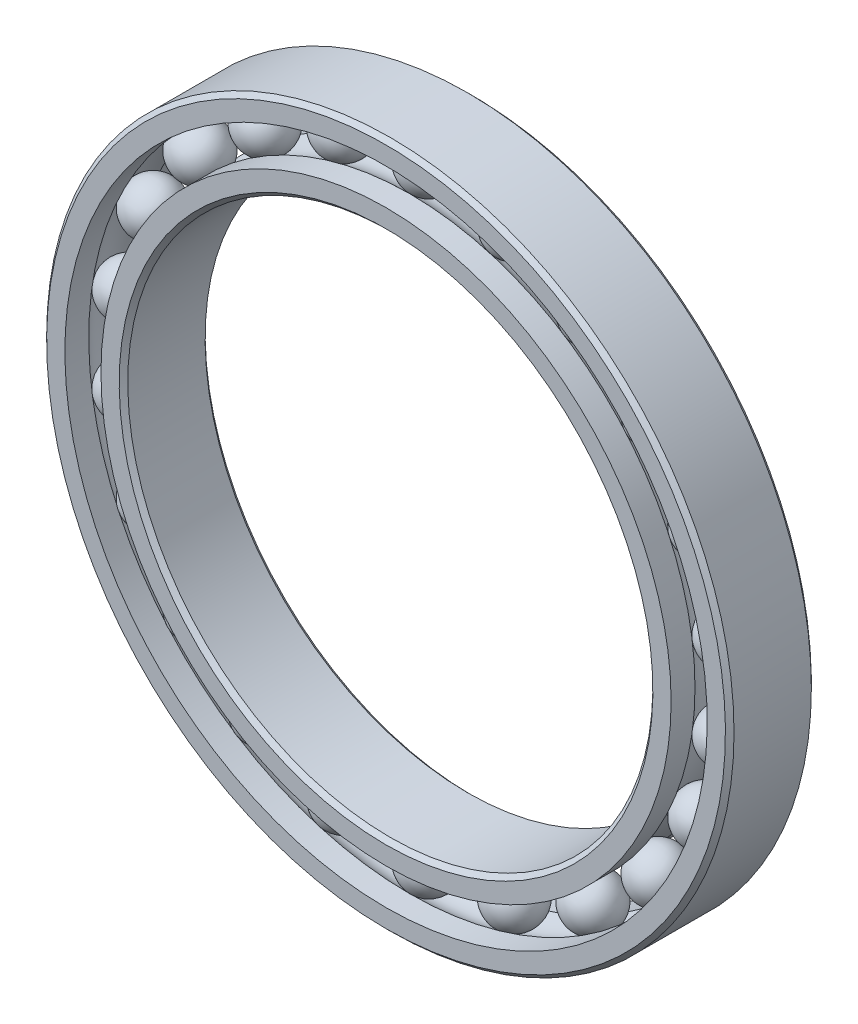
ISO-10303-21;
HEADER;
FILE_DESCRIPTION(('STEP AP214'),'2;1');
FILE_NAME('part.step','',(''),(''),'','','');
FILE_SCHEMA(('AUTOMOTIVE_DESIGN { 1 0 10303 214 1 1 1 1 }'));
ENDSEC;
DATA;
#1=APPLICATION_CONTEXT('core data for automotive mechanical design processes');
#2=APPLICATION_PROTOCOL_DEFINITION('international standard','automotive_design',2000,#1);
#3=PRODUCT_CONTEXT('',#1,'mechanical');
#4=PRODUCT('Part','Part','',(#3));
#5=PRODUCT_RELATED_PRODUCT_CATEGORY('part','',(#4));
#6=PRODUCT_DEFINITION_FORMATION('','',#4);
#7=PRODUCT_DEFINITION_CONTEXT('part definition',#1,'design');
#8=PRODUCT_DEFINITION('design','',#6,#7);
#9=PRODUCT_DEFINITION_SHAPE('','',#8);
#10=(LENGTH_UNIT() NAMED_UNIT(*) SI_UNIT(.MILLI.,.METRE.));
#11=(NAMED_UNIT(*) PLANE_ANGLE_UNIT() SI_UNIT($,.RADIAN.));
#12=(NAMED_UNIT(*) SI_UNIT($,.STERADIAN.) SOLID_ANGLE_UNIT());
#13=UNCERTAINTY_MEASURE_WITH_UNIT(LENGTH_MEASURE(1.E-05),#10,'distance_accuracy_value','');
#14=(GEOMETRIC_REPRESENTATION_CONTEXT(3) GLOBAL_UNCERTAINTY_ASSIGNED_CONTEXT((#13)) GLOBAL_UNIT_ASSIGNED_CONTEXT((#10,
#11,#12)) REPRESENTATION_CONTEXT('',''));
#15=CARTESIAN_POINT('',(0.,0.,0.));
#16=DIRECTION('',(0.,0.,1.));
#17=DIRECTION('',(1.,0.,0.));
#18=AXIS2_PLACEMENT_3D('',#15,#16,#17);
#19=CARTESIAN_POINT('',(8.94500867971496,30.4639019122604,0.));
#20=DIRECTION('',(0.,0.,1.));
#21=DIRECTION('',(0.281732556841416,0.959492973614501,0.));
#22=AXIS2_PLACEMENT_3D('',#19,#20,#21);
#23=SPHERICAL_SURFACE('',#22,2.75098186736443);
#24=CARTESIAN_POINT('',(8.94500867971496,30.4639019122604,2.75098186736443));
#25=VERTEX_POINT('',#24);
#26=VERTEX_LOOP('',#25);
#27=FACE_BOUND('',#26,.T.);
#28=ADVANCED_FACE('F46',(#27),#23,.T.);
#29=CLOSED_SHELL('',(#28));
#30=MANIFOLD_SOLID_BREP('B2',#29);
#31=CARTESIAN_POINT('',(17.1653459542149,26.7097996673902,0.));
#32=DIRECTION('',(0.,0.,1.));
#33=DIRECTION('',(0.540640817455586,0.841253532831188,0.));
#34=AXIS2_PLACEMENT_3D('',#31,#32,#33);
#35=SPHERICAL_SURFACE('',#34,2.75098186736443);
#36=CARTESIAN_POINT('',(17.1653459542149,26.7097996673902,2.75098186736443));
#37=VERTEX_POINT('',#36);
#38=VERTEX_LOOP('',#37);
#39=FACE_BOUND('',#38,.T.);
#40=ADVANCED_FACE('F65',(#39),#35,.T.);
#41=CLOSED_SHELL('',(#40));
#42=MANIFOLD_SOLID_BREP('B6',#41);
#43=CARTESIAN_POINT('',(23.9950489857474,20.7918283027631,0.));
#44=DIRECTION('',(0.,0.,1.));
#45=DIRECTION('',(0.75574957435425,0.654860733945295,0.));
#46=AXIS2_PLACEMENT_3D('',#43,#44,#45);
#47=SPHERICAL_SURFACE('',#46,2.75098186736443);
#48=CARTESIAN_POINT('',(23.9950489857474,20.7918283027631,2.75098186736443));
#49=VERTEX_POINT('',#48);
#50=VERTEX_LOOP('',#49);
#51=FACE_BOUND('',#50,.T.);
#52=ADVANCED_FACE('F84',(#51),#47,.T.);
#53=CLOSED_SHELL('',(#52));
#54=MANIFOLD_SOLID_BREP('B42',#53);
#55=CARTESIAN_POINT('',(28.8808158525058,13.1894266628102,0.));
#56=DIRECTION('',(0.,0.,1.));
#57=DIRECTION('',(0.909631995354513,0.415415013001897,0.));
#58=AXIS2_PLACEMENT_3D('',#55,#56,#57);
#59=SPHERICAL_SURFACE('',#58,2.75098186736443);
#60=CARTESIAN_POINT('',(28.8808158525058,13.1894266628102,2.75098186736442));
#61=VERTEX_POINT('',#60);
#62=VERTEX_LOOP('',#61);
#63=FACE_BOUND('',#62,.T.);
#64=ADVANCED_FACE('F103',(#63),#59,.T.);
#65=CLOSED_SHELL('',(#64));
#66=MANIFOLD_SOLID_BREP('B61',#65);
#67=CARTESIAN_POINT('',(31.4268307797196,4.51849611517716,0.));
#68=DIRECTION('',(0.,0.,1.));
#69=DIRECTION('',(0.989821441880931,0.142314838273296,0.));
#70=AXIS2_PLACEMENT_3D('',#67,#68,#69);
#71=SPHERICAL_SURFACE('',#70,2.75098186736443);
#72=CARTESIAN_POINT('',(31.4268307797196,4.51849611517716,2.75098186736442));
#73=VERTEX_POINT('',#72);
#74=VERTEX_LOOP('',#73);
#75=FACE_BOUND('',#74,.T.);
#76=ADVANCED_FACE('F122',(#75),#71,.T.);
#77=CLOSED_SHELL('',(#76));
#78=MANIFOLD_SOLID_BREP('B80',#77);
#79=CARTESIAN_POINT('',(31.4268307797197,-4.51849611517647,0.));
#80=DIRECTION('',(0.,0.,1.));
#81=DIRECTION('',(0.989821441880934,-0.142314838273275,0.));
#82=AXIS2_PLACEMENT_3D('',#79,#80,#81);
#83=SPHERICAL_SURFACE('',#82,2.75098186736443);
#84=CARTESIAN_POINT('',(31.4268307797197,-4.51849611517647,2.75098186736442));
#85=VERTEX_POINT('',#84);
#86=VERTEX_LOOP('',#85);
#87=FACE_BOUND('',#86,.T.);
#88=ADVANCED_FACE('F141',(#87),#83,.T.);
#89=CLOSED_SHELL('',(#88));
#90=MANIFOLD_SOLID_BREP('B99',#89);
#91=CARTESIAN_POINT('',(28.8808158525061,-13.1894266628096,0.));
#92=DIRECTION('',(0.,0.,1.));
#93=DIRECTION('',(0.909631995354522,-0.415415013001877,0.));
#94=AXIS2_PLACEMENT_3D('',#91,#92,#93);
#95=SPHERICAL_SURFACE('',#94,2.75098186736443);
#96=CARTESIAN_POINT('',(28.8808158525061,-13.1894266628096,2.75098186736442));
#97=VERTEX_POINT('',#96);
#98=VERTEX_LOOP('',#97);
#99=FACE_BOUND('',#98,.T.);
#100=ADVANCED_FACE('F160',(#99),#95,.T.);
#101=CLOSED_SHELL('',(#100));
#102=MANIFOLD_SOLID_BREP('B118',#101);
#103=CARTESIAN_POINT('',(23.9950489857479,-20.7918283027626,0.));
#104=DIRECTION('',(0.,0.,1.));
#105=DIRECTION('',(0.755749574354264,-0.654860733945278,0.));
#106=AXIS2_PLACEMENT_3D('',#103,#104,#105);
#107=SPHERICAL_SURFACE('',#106,2.75098186736443);
#108=CARTESIAN_POINT('',(23.9950489857479,-20.7918283027626,2.75098186736442));
#109=VERTEX_POINT('',#108);
#110=VERTEX_LOOP('',#109);
#111=FACE_BOUND('',#110,.T.);
#112=ADVANCED_FACE('F179',(#111),#107,.T.);
#113=CLOSED_SHELL('',(#112));
#114=MANIFOLD_SOLID_BREP('B137',#113);
#115=CARTESIAN_POINT('',(17.1653459542154,-26.7097996673899,0.));
#116=DIRECTION('',(0.,0.,1.));
#117=DIRECTION('',(0.540640817455605,-0.841253532831177,0.));
#118=AXIS2_PLACEMENT_3D('',#115,#116,#117);
#119=SPHERICAL_SURFACE('',#118,2.75098186736443);
#120=CARTESIAN_POINT('',(17.1653459542154,-26.7097996673899,2.75098186736442));
#121=VERTEX_POINT('',#120);
#122=VERTEX_LOOP('',#121);
#123=FACE_BOUND('',#122,.T.);
#124=ADVANCED_FACE('F198',(#123),#119,.T.);
#125=CLOSED_SHELL('',(#124));
#126=MANIFOLD_SOLID_BREP('B156',#125);
#127=CARTESIAN_POINT('',(8.94500867971563,-30.4639019122602,0.));
#128=DIRECTION('',(0.,0.,1.));
#129=DIRECTION('',(0.281732556841437,-0.959492973614495,0.));
#130=AXIS2_PLACEMENT_3D('',#127,#128,#129);
#131=SPHERICAL_SURFACE('',#130,2.75098186736443);
#132=CARTESIAN_POINT('',(8.94500867971563,-30.4639019122602,2.75098186736442));
#133=VERTEX_POINT('',#132);
#134=VERTEX_LOOP('',#133);
#135=FACE_BOUND('',#134,.T.);
#136=ADVANCED_FACE('F217',(#135),#131,.T.);
#137=CLOSED_SHELL('',(#136));
#138=MANIFOLD_SOLID_BREP('B175',#137);
#139=CARTESIAN_POINT('',(0.,-31.75,0.));
#140=DIRECTION('',(0.,0.,1.));
#141=DIRECTION('',(0.,-1.,0.));
#142=AXIS2_PLACEMENT_3D('',#139,#140,#141);
#143=SPHERICAL_SURFACE('',#142,2.75098186736443);
#144=CARTESIAN_POINT('',(0.,-31.75,2.75098186736442));
#145=VERTEX_POINT('',#144);
#146=VERTEX_LOOP('',#145);
#147=FACE_BOUND('',#146,.T.);
#148=ADVANCED_FACE('F236',(#147),#143,.T.);
#149=CLOSED_SHELL('',(#148));
#150=MANIFOLD_SOLID_BREP('B194',#149);
#151=CARTESIAN_POINT('',(-8.94500867971519,-30.4639019122604,0.));
#152=DIRECTION('',(0.,0.,1.));
#153=DIRECTION('',(-0.281732556841423,-0.959492973614499,0.));
#154=AXIS2_PLACEMENT_3D('',#151,#152,#153);
#155=SPHERICAL_SURFACE('',#154,2.75098186736443);
#156=CARTESIAN_POINT('',(-8.94500867971519,-30.4639019122604,2.75098186736442));
#157=VERTEX_POINT('',#156);
#158=VERTEX_LOOP('',#157);
#159=FACE_BOUND('',#158,.T.);
#160=ADVANCED_FACE('F255',(#159),#155,.T.);
#161=CLOSED_SHELL('',(#160));
#162=MANIFOLD_SOLID_BREP('B213',#161);
#163=CARTESIAN_POINT('',(-17.1653459542151,-26.7097996673901,0.));
#164=DIRECTION('',(0.,0.,1.));
#165=DIRECTION('',(-0.540640817455593,-0.841253532831184,0.));
#166=AXIS2_PLACEMENT_3D('',#163,#164,#165);
#167=SPHERICAL_SURFACE('',#166,2.75098186736443);
#168=CARTESIAN_POINT('',(-17.1653459542151,-26.7097996673901,2.75098186736442));
#169=VERTEX_POINT('',#168);
#170=VERTEX_LOOP('',#169);
#171=FACE_BOUND('',#170,.T.);
#172=ADVANCED_FACE('F274',(#171),#167,.T.);
#173=CLOSED_SHELL('',(#172));
#174=MANIFOLD_SOLID_BREP('B232',#173);
#175=CARTESIAN_POINT('',(-23.9950489857476,-20.7918283027629,0.));
#176=DIRECTION('',(0.,0.,1.));
#177=DIRECTION('',(-0.755749574354255,-0.654860733945289,0.));
#178=AXIS2_PLACEMENT_3D('',#175,#176,#177);
#179=SPHERICAL_SURFACE('',#178,2.75098186736443);
#180=CARTESIAN_POINT('',(-23.9950489857476,-20.7918283027629,2.75098186736442));
#181=VERTEX_POINT('',#180);
#182=VERTEX_LOOP('',#181);
#183=FACE_BOUND('',#182,.T.);
#184=ADVANCED_FACE('F293',(#183),#179,.T.);
#185=CLOSED_SHELL('',(#184));
#186=MANIFOLD_SOLID_BREP('B251',#185);
#187=CARTESIAN_POINT('',(-28.8808158525059,-13.18942666281,0.));
#188=DIRECTION('',(0.,0.,1.));
#189=DIRECTION('',(-0.909631995354516,-0.415415013001891,0.));
#190=AXIS2_PLACEMENT_3D('',#187,#188,#189);
#191=SPHERICAL_SURFACE('',#190,2.75098186736443);
#192=CARTESIAN_POINT('',(-28.8808158525059,-13.18942666281,2.75098186736442));
#193=VERTEX_POINT('',#192);
#194=VERTEX_LOOP('',#193);
#195=FACE_BOUND('',#194,.T.);
#196=ADVANCED_FACE('F312',(#195),#191,.T.);
#197=CLOSED_SHELL('',(#196));
#198=MANIFOLD_SOLID_BREP('B270',#197);
#199=CARTESIAN_POINT('',(-31.4268307797196,-4.51849611517692,0.));
#200=DIRECTION('',(0.,0.,1.));
#201=DIRECTION('',(-0.989821441880932,-0.142314838273289,0.));
#202=AXIS2_PLACEMENT_3D('',#199,#200,#201);
#203=SPHERICAL_SURFACE('',#202,2.75098186736443);
#204=CARTESIAN_POINT('',(-31.4268307797196,-4.51849611517692,2.75098186736442));
#205=VERTEX_POINT('',#204);
#206=VERTEX_LOOP('',#205);
#207=FACE_BOUND('',#206,.T.);
#208=ADVANCED_FACE('F331',(#207),#203,.T.);
#209=CLOSED_SHELL('',(#208));
#210=MANIFOLD_SOLID_BREP('B289',#209);
#211=CARTESIAN_POINT('',(-31.4268307797196,4.5184961151767,0.));
#212=DIRECTION('',(0.,0.,1.));
#213=DIRECTION('',(-0.989821441880933,0.142314838273282,0.));
#214=AXIS2_PLACEMENT_3D('',#211,#212,#213);
#215=SPHERICAL_SURFACE('',#214,2.75098186736443);
#216=CARTESIAN_POINT('',(-31.4268307797196,4.5184961151767,2.75098186736442));
#217=VERTEX_POINT('',#216);
#218=VERTEX_LOOP('',#217);
#219=FACE_BOUND('',#218,.T.);
#220=ADVANCED_FACE('F350',(#219),#215,.T.);
#221=CLOSED_SHELL('',(#220));
#222=MANIFOLD_SOLID_BREP('B308',#221);
#223=CARTESIAN_POINT('',(-28.880815852506,13.1894266628098,0.));
#224=DIRECTION('',(0.,0.,1.));
#225=DIRECTION('',(-0.909631995354519,0.415415013001884,0.));
#226=AXIS2_PLACEMENT_3D('',#223,#224,#225);
#227=SPHERICAL_SURFACE('',#226,2.75098186736443);
#228=CARTESIAN_POINT('',(-28.880815852506,13.1894266628098,2.75098186736442));
#229=VERTEX_POINT('',#228);
#230=VERTEX_LOOP('',#229);
#231=FACE_BOUND('',#230,.T.);
#232=ADVANCED_FACE('F369',(#231),#227,.T.);
#233=CLOSED_SHELL('',(#232));
#234=MANIFOLD_SOLID_BREP('B327',#233);
#235=CARTESIAN_POINT('',(-23.9950489857477,20.7918283027628,0.));
#236=DIRECTION('',(0.,0.,1.));
#237=DIRECTION('',(-0.75574957435426,0.654860733945284,0.));
#238=AXIS2_PLACEMENT_3D('',#235,#236,#237);
#239=SPHERICAL_SURFACE('',#238,2.75098186736443);
#240=CARTESIAN_POINT('',(-23.9950489857477,20.7918283027628,2.75098186736443));
#241=VERTEX_POINT('',#240);
#242=VERTEX_LOOP('',#241);
#243=FACE_BOUND('',#242,.T.);
#244=ADVANCED_FACE('F388',(#243),#239,.T.);
#245=CLOSED_SHELL('',(#244));
#246=MANIFOLD_SOLID_BREP('B346',#245);
#247=CARTESIAN_POINT('',(-17.1653459542153,26.70979966739,0.));
#248=DIRECTION('',(0.,0.,1.));
#249=DIRECTION('',(-0.540640817455599,0.841253532831181,0.));
#250=AXIS2_PLACEMENT_3D('',#247,#248,#249);
#251=SPHERICAL_SURFACE('',#250,2.75098186736443);
#252=CARTESIAN_POINT('',(-17.1653459542153,26.70979966739,2.75098186736443));
#253=VERTEX_POINT('',#252);
#254=VERTEX_LOOP('',#253);
#255=FACE_BOUND('',#254,.T.);
#256=ADVANCED_FACE('F407',(#255),#251,.T.);
#257=CLOSED_SHELL('',(#256));
#258=MANIFOLD_SOLID_BREP('B365',#257);
#259=CARTESIAN_POINT('',(-8.94500867971541,30.4639019122603,0.));
#260=DIRECTION('',(0.,0.,1.));
#261=DIRECTION('',(-0.28173255684143,0.959492973614497,0.));
#262=AXIS2_PLACEMENT_3D('',#259,#260,#261);
#263=SPHERICAL_SURFACE('',#262,2.75098186736443);
#264=CARTESIAN_POINT('',(-8.94500867971541,30.4639019122603,2.75098186736443));
#265=VERTEX_POINT('',#264);
#266=VERTEX_LOOP('',#265);
#267=FACE_BOUND('',#266,.T.);
#268=ADVANCED_FACE('F426',(#267),#263,.T.);
#269=CLOSED_SHELL('',(#268));
#270=MANIFOLD_SOLID_BREP('B384',#269);
#271=CARTESIAN_POINT('',(0.,31.75,0.));
#272=DIRECTION('',(0.,0.,1.));
#273=DIRECTION('',(0.,1.,0.));
#274=AXIS2_PLACEMENT_3D('',#271,#272,#273);
#275=SPHERICAL_SURFACE('',#274,2.75098186736443);
#276=CARTESIAN_POINT('',(0.,31.75,2.75098186736443));
#277=VERTEX_POINT('',#276);
#278=VERTEX_LOOP('',#277);
#279=FACE_BOUND('',#278,.T.);
#280=ADVANCED_FACE('F447',(#279),#275,.T.);
#281=CLOSED_SHELL('',(#280));
#282=MANIFOLD_SOLID_BREP('B403',#281);
#283=CARTESIAN_POINT('',(0.,29.8611111111111,4.50000000000001));
#284=DIRECTION('',(0.,0.,-1.));
#285=DIRECTION('',(0.,1.,0.));
#286=AXIS2_PLACEMENT_3D('',#283,#284,#285);
#287=PLANE('',#286);
#288=CARTESIAN_POINT('',(0.,0.,4.5));
#289=DIRECTION('',(0.,0.,1.));
#290=DIRECTION('',(0.,-1.,0.));
#291=AXIS2_PLACEMENT_3D('',#288,#289,#290);
#292=CIRCLE('',#291,27.95);
#293=CARTESIAN_POINT('',(0.,-27.95,4.5));
#294=VERTEX_POINT('',#293);
#295=EDGE_CURVE('E504',#294,#294,#292,.T.);
#296=ORIENTED_EDGE('',*,*,#295,.F.);
#297=EDGE_LOOP('',(#296));
#298=FACE_BOUND('',#297,.T.);
#299=CARTESIAN_POINT('',(0.,0.,4.5));
#300=DIRECTION('',(0.,0.,1.));
#301=DIRECTION('',(0.,-1.,0.));
#302=AXIS2_PLACEMENT_3D('',#299,#300,#301);
#303=CIRCLE('',#302,29.8611111111111);
#304=CARTESIAN_POINT('',(0.,-29.8611111111111,4.5));
#305=VERTEX_POINT('',#304);
#306=EDGE_CURVE('E446',#305,#305,#303,.T.);
#307=ORIENTED_EDGE('',*,*,#306,.T.);
#308=EDGE_LOOP('',(#307));
#309=FACE_BOUND('',#308,.T.);
#310=ADVANCED_FACE('F467',(#298,#309),#287,.F.);
#311=CARTESIAN_POINT('',(0.,0.,4.49999999999999));
#312=DIRECTION('',(0.,0.,1.));
#313=DIRECTION('',(0.,-1.,0.));
#314=AXIS2_PLACEMENT_3D('',#311,#312,#313);
#315=CYLINDRICAL_SURFACE('',#314,29.8611111111111);
#316=ORIENTED_EDGE('',*,*,#306,.F.);
#317=EDGE_LOOP('',(#316));
#318=FACE_BOUND('',#317,.T.);
#319=CARTESIAN_POINT('',(0.,0.,1.99999999999999));
#320=DIRECTION('',(0.,0.,1.));
#321=DIRECTION('',(0.,-1.,0.));
#322=AXIS2_PLACEMENT_3D('',#319,#320,#321);
#323=CIRCLE('',#322,29.8611111111111);
#324=CARTESIAN_POINT('',(0.,-29.8611111111111,1.99999999999999));
#325=VERTEX_POINT('',#324);
#326=EDGE_CURVE('E474',#325,#325,#323,.T.);
#327=ORIENTED_EDGE('',*,*,#326,.T.);
#328=EDGE_LOOP('',(#327));
#329=FACE_BOUND('',#328,.T.);
#330=ADVANCED_FACE('F513',(#318,#329),#315,.T.);
#331=CARTESIAN_POINT('',(0.,0.,0.));
#332=DIRECTION('',(0.,0.,1.));
#333=DIRECTION('',(0.,-1.,0.));
#334=AXIS2_PLACEMENT_3D('',#331,#332,#333);
#335=TOROIDAL_SURFACE('',#334,31.75,2.75098186736443);
#336=ORIENTED_EDGE('',*,*,#326,.F.);
#337=EDGE_LOOP('',(#336));
#338=FACE_BOUND('',#337,.T.);
#339=CARTESIAN_POINT('',(0.,0.,-2.));
#340=DIRECTION('',(0.,0.,1.));
#341=DIRECTION('',(0.,-1.,0.));
#342=AXIS2_PLACEMENT_3D('',#339,#340,#341);
#343=CIRCLE('',#342,29.8611111111111);
#344=CARTESIAN_POINT('',(0.,-29.8611111111111,-2.));
#345=VERTEX_POINT('',#344);
#346=EDGE_CURVE('E480',#345,#345,#343,.T.);
#347=ORIENTED_EDGE('',*,*,#346,.T.);
#348=EDGE_LOOP('',(#347));
#349=FACE_BOUND('',#348,.T.);
#350=ADVANCED_FACE('F517',(#338,#349),#335,.F.);
#351=CARTESIAN_POINT('',(0.,0.,4.49999999999999));
#352=DIRECTION('',(0.,0.,1.));
#353=DIRECTION('',(0.,-1.,0.));
#354=AXIS2_PLACEMENT_3D('',#351,#352,#353);
#355=CYLINDRICAL_SURFACE('',#354,29.8611111111111);
#356=ORIENTED_EDGE('',*,*,#346,.F.);
#357=EDGE_LOOP('',(#356));
#358=FACE_BOUND('',#357,.T.);
#359=CARTESIAN_POINT('',(0.,0.,-4.50000000000001));
#360=DIRECTION('',(0.,0.,1.));
#361=DIRECTION('',(0.,-1.,0.));
#362=AXIS2_PLACEMENT_3D('',#359,#360,#361);
#363=CIRCLE('',#362,29.8611111111111);
#364=CARTESIAN_POINT('',(0.,-29.8611111111111,-4.50000000000001));
#365=VERTEX_POINT('',#364);
#366=EDGE_CURVE('E486',#365,#365,#363,.T.);
#367=ORIENTED_EDGE('',*,*,#366,.T.);
#368=EDGE_LOOP('',(#367));
#369=FACE_BOUND('',#368,.T.);
#370=ADVANCED_FACE('F522',(#358,#369),#355,.T.);
#371=CARTESIAN_POINT('',(0.,27.95,-4.50000000000001));
#372=DIRECTION('',(0.,0.,1.));
#373=DIRECTION('',(0.,-1.,0.));
#374=AXIS2_PLACEMENT_3D('',#371,#372,#373);
#375=PLANE('',#374);
#376=ORIENTED_EDGE('',*,*,#366,.F.);
#377=EDGE_LOOP('',(#376));
#378=FACE_BOUND('',#377,.T.);
#379=CARTESIAN_POINT('',(0.,0.,-4.50000000000001));
#380=DIRECTION('',(0.,0.,1.));
#381=DIRECTION('',(0.,-1.,0.));
#382=AXIS2_PLACEMENT_3D('',#379,#380,#381);
#383=CIRCLE('',#382,27.95);
#384=CARTESIAN_POINT('',(0.,-27.95,-4.50000000000002));
#385=VERTEX_POINT('',#384);
#386=EDGE_CURVE('E492',#385,#385,#383,.T.);
#387=ORIENTED_EDGE('',*,*,#386,.T.);
#388=EDGE_LOOP('',(#387));
#389=FACE_BOUND('',#388,.T.);
#390=ADVANCED_FACE('F528',(#378,#389),#375,.F.);
#391=CARTESIAN_POINT('',(0.,0.,-4.05000000000001));
#392=DIRECTION('',(0.,0.,-1.));
#393=DIRECTION('',(0.,1.,0.));
#394=AXIS2_PLACEMENT_3D('',#391,#392,#393);
#395=CONICAL_SURFACE('',#394,27.5,0.785398163397437);
#396=ORIENTED_EDGE('',*,*,#386,.F.);
#397=EDGE_LOOP('',(#396));
#398=FACE_BOUND('',#397,.T.);
#399=CARTESIAN_POINT('',(0.,0.,-4.05000000000001));
#400=DIRECTION('',(0.,0.,1.));
#401=DIRECTION('',(0.,-1.,0.));
#402=AXIS2_PLACEMENT_3D('',#399,#400,#401);
#403=CIRCLE('',#402,27.5);
#404=CARTESIAN_POINT('',(0.,-27.5,-4.05000000000001));
#405=VERTEX_POINT('',#404);
#406=EDGE_CURVE('E496',#405,#405,#403,.T.);
#407=ORIENTED_EDGE('',*,*,#406,.T.);
#408=EDGE_LOOP('',(#407));
#409=FACE_BOUND('',#408,.T.);
#410=ADVANCED_FACE('F532',(#398,#409),#395,.F.);
#411=CARTESIAN_POINT('',(0.,0.,4.49999999999999));
#412=DIRECTION('',(0.,0.,1.));
#413=DIRECTION('',(0.,-1.,0.));
#414=AXIS2_PLACEMENT_3D('',#411,#412,#413);
#415=CYLINDRICAL_SURFACE('',#414,27.5);
#416=ORIENTED_EDGE('',*,*,#406,.F.);
#417=EDGE_LOOP('',(#416));
#418=FACE_BOUND('',#417,.T.);
#419=CARTESIAN_POINT('',(0.,0.,4.05000000000002));
#420=DIRECTION('',(0.,0.,1.));
#421=DIRECTION('',(0.,-1.,0.));
#422=AXIS2_PLACEMENT_3D('',#419,#420,#421);
#423=CIRCLE('',#422,27.5);
#424=CARTESIAN_POINT('',(0.,-27.5,4.05000000000001));
#425=VERTEX_POINT('',#424);
#426=EDGE_CURVE('E500',#425,#425,#423,.T.);
#427=ORIENTED_EDGE('',*,*,#426,.T.);
#428=EDGE_LOOP('',(#427));
#429=FACE_BOUND('',#428,.T.);
#430=ADVANCED_FACE('F536',(#418,#429),#415,.F.);
#431=CARTESIAN_POINT('',(0.,0.,4.5));
#432=DIRECTION('',(0.,0.,1.));
#433=DIRECTION('',(0.,-1.,0.));
#434=AXIS2_PLACEMENT_3D('',#431,#432,#433);
#435=CONICAL_SURFACE('',#434,27.95,0.785398163397479);
#436=ORIENTED_EDGE('',*,*,#426,.F.);
#437=EDGE_LOOP('',(#436));
#438=FACE_BOUND('',#437,.T.);
#439=ORIENTED_EDGE('',*,*,#295,.T.);
#440=EDGE_LOOP('',(#439));
#441=FACE_BOUND('',#440,.T.);
#442=ADVANCED_FACE('F510',(#438,#441),#435,.F.);
#443=CLOSED_SHELL('',(#310,#330,#350,#370,#390,#410,#430,#442));
#444=MANIFOLD_SOLID_BREP('B422',#443);
#445=CARTESIAN_POINT('',(0.,0.,4.49999999999999));
#446=DIRECTION('',(0.,0.,1.));
#447=DIRECTION('',(0.,-1.,0.));
#448=AXIS2_PLACEMENT_3D('',#445,#446,#447);
#449=CYLINDRICAL_SURFACE('',#448,36.);
#450=CARTESIAN_POINT('',(0.,0.,4.05));
#451=DIRECTION('',(0.,0.,1.));
#452=DIRECTION('',(0.,-1.,0.));
#453=AXIS2_PLACEMENT_3D('',#450,#451,#452);
#454=CIRCLE('',#453,36.);
#455=CARTESIAN_POINT('',(0.,-36.,4.04999999999999));
#456=VERTEX_POINT('',#455);
#457=EDGE_CURVE('E466',#456,#456,#454,.T.);
#458=ORIENTED_EDGE('',*,*,#457,.F.);
#459=EDGE_LOOP('',(#458));
#460=FACE_BOUND('',#459,.T.);
#461=CARTESIAN_POINT('',(0.,0.,-4.05000000000001));
#462=DIRECTION('',(0.,0.,1.));
#463=DIRECTION('',(0.,-1.,0.));
#464=AXIS2_PLACEMENT_3D('',#461,#462,#463);
#465=CIRCLE('',#464,36.);
#466=CARTESIAN_POINT('',(0.,-36.,-4.05000000000001));
#467=VERTEX_POINT('',#466);
#468=EDGE_CURVE('E642',#467,#467,#465,.T.);
#469=ORIENTED_EDGE('',*,*,#468,.T.);
#470=EDGE_LOOP('',(#469));
#471=FACE_BOUND('',#470,.T.);
#472=ADVANCED_FACE('F605',(#460,#471),#449,.T.);
#473=CARTESIAN_POINT('',(0.,0.,4.05));
#474=DIRECTION('',(0.,0.,-1.));
#475=DIRECTION('',(0.,1.,0.));
#476=AXIS2_PLACEMENT_3D('',#473,#474,#475);
#477=CONICAL_SURFACE('',#476,36.,0.78539816339745);
#478=CARTESIAN_POINT('',(0.,0.,4.49999999999999));
#479=DIRECTION('',(0.,0.,1.));
#480=DIRECTION('',(0.,-1.,0.));
#481=AXIS2_PLACEMENT_3D('',#478,#479,#480);
#482=CIRCLE('',#481,35.55);
#483=CARTESIAN_POINT('',(0.,-35.55,4.49999999999999));
#484=VERTEX_POINT('',#483);
#485=EDGE_CURVE('E612',#484,#484,#482,.T.);
#486=ORIENTED_EDGE('',*,*,#485,.F.);
#487=EDGE_LOOP('',(#486));
#488=FACE_BOUND('',#487,.T.);
#489=ORIENTED_EDGE('',*,*,#457,.T.);
#490=EDGE_LOOP('',(#489));
#491=FACE_BOUND('',#490,.T.);
#492=ADVANCED_FACE('F681',(#488,#491),#477,.T.);
#493=CARTESIAN_POINT('',(0.,35.55,4.5));
#494=DIRECTION('',(0.,0.,-1.));
#495=DIRECTION('',(0.,1.,0.));
#496=AXIS2_PLACEMENT_3D('',#493,#494,#495);
#497=PLANE('',#496);
#498=CARTESIAN_POINT('',(0.,0.,4.49999999999999));
#499=DIRECTION('',(0.,0.,1.));
#500=DIRECTION('',(0.,-1.,0.));
#501=AXIS2_PLACEMENT_3D('',#498,#499,#500);
#502=CIRCLE('',#501,33.6388888888889);
#503=CARTESIAN_POINT('',(0.,-33.6388888888889,4.49999999999998));
#504=VERTEX_POINT('',#503);
#505=EDGE_CURVE('E618',#504,#504,#502,.T.);
#506=ORIENTED_EDGE('',*,*,#505,.F.);
#507=EDGE_LOOP('',(#506));
#508=FACE_BOUND('',#507,.T.);
#509=ORIENTED_EDGE('',*,*,#485,.T.);
#510=EDGE_LOOP('',(#509));
#511=FACE_BOUND('',#510,.T.);
#512=ADVANCED_FACE('F676',(#508,#511),#497,.F.);
#513=CARTESIAN_POINT('',(0.,0.,4.49999999999999));
#514=DIRECTION('',(0.,0.,1.));
#515=DIRECTION('',(0.,-1.,0.));
#516=AXIS2_PLACEMENT_3D('',#513,#514,#515);
#517=CYLINDRICAL_SURFACE('',#516,33.6388888888889);
#518=CARTESIAN_POINT('',(0.,0.,1.99999999999999));
#519=DIRECTION('',(0.,0.,1.));
#520=DIRECTION('',(0.,-1.,0.));
#521=AXIS2_PLACEMENT_3D('',#518,#519,#520);
#522=CIRCLE('',#521,33.6388888888889);
#523=CARTESIAN_POINT('',(0.,-33.6388888888889,1.99999999999999));
#524=VERTEX_POINT('',#523);
#525=EDGE_CURVE('E624',#524,#524,#522,.T.);
#526=ORIENTED_EDGE('',*,*,#525,.F.);
#527=EDGE_LOOP('',(#526));
#528=FACE_BOUND('',#527,.T.);
#529=ORIENTED_EDGE('',*,*,#505,.T.);
#530=EDGE_LOOP('',(#529));
#531=FACE_BOUND('',#530,.T.);
#532=ADVANCED_FACE('F670',(#528,#531),#517,.F.);
#533=CARTESIAN_POINT('',(0.,0.,0.));
#534=DIRECTION('',(0.,0.,1.));
#535=DIRECTION('',(0.,-1.,0.));
#536=AXIS2_PLACEMENT_3D('',#533,#534,#535);
#537=TOROIDAL_SURFACE('',#536,31.75,2.75098186736443);
#538=CARTESIAN_POINT('',(0.,0.,-2.00000000000001));
#539=DIRECTION('',(0.,0.,1.));
#540=DIRECTION('',(0.,-1.,0.));
#541=AXIS2_PLACEMENT_3D('',#538,#539,#540);
#542=CIRCLE('',#541,33.6388888888889);
#543=CARTESIAN_POINT('',(0.,-33.6388888888889,-2.00000000000001));
#544=VERTEX_POINT('',#543);
#545=EDGE_CURVE('E630',#544,#544,#542,.T.);
#546=ORIENTED_EDGE('',*,*,#545,.F.);
#547=EDGE_LOOP('',(#546));
#548=FACE_BOUND('',#547,.T.);
#549=ORIENTED_EDGE('',*,*,#525,.T.);
#550=EDGE_LOOP('',(#549));
#551=FACE_BOUND('',#550,.T.);
#552=ADVANCED_FACE('F664',(#548,#551),#537,.F.);
#553=CARTESIAN_POINT('',(0.,0.,4.49999999999999));
#554=DIRECTION('',(0.,0.,1.));
#555=DIRECTION('',(0.,-1.,0.));
#556=AXIS2_PLACEMENT_3D('',#553,#554,#555);
#557=CYLINDRICAL_SURFACE('',#556,33.6388888888889);
#558=CARTESIAN_POINT('',(0.,0.,-4.5));
#559=DIRECTION('',(0.,0.,1.));
#560=DIRECTION('',(0.,-1.,0.));
#561=AXIS2_PLACEMENT_3D('',#558,#559,#560);
#562=CIRCLE('',#561,33.6388888888889);
#563=CARTESIAN_POINT('',(0.,-33.6388888888889,-4.50000000000001));
#564=VERTEX_POINT('',#563);
#565=EDGE_CURVE('E634',#564,#564,#562,.T.);
#566=ORIENTED_EDGE('',*,*,#565,.F.);
#567=EDGE_LOOP('',(#566));
#568=FACE_BOUND('',#567,.T.);
#569=ORIENTED_EDGE('',*,*,#545,.T.);
#570=EDGE_LOOP('',(#569));
#571=FACE_BOUND('',#570,.T.);
#572=ADVANCED_FACE('F658',(#568,#571),#557,.F.);
#573=CARTESIAN_POINT('',(0.,35.55,-4.5));
#574=DIRECTION('',(0.,0.,1.));
#575=DIRECTION('',(0.,-1.,0.));
#576=AXIS2_PLACEMENT_3D('',#573,#574,#575);
#577=PLANE('',#576);
#578=CARTESIAN_POINT('',(0.,0.,-4.50000000000001));
#579=DIRECTION('',(0.,0.,1.));
#580=DIRECTION('',(0.,-1.,0.));
#581=AXIS2_PLACEMENT_3D('',#578,#579,#580);
#582=CIRCLE('',#581,35.55);
#583=CARTESIAN_POINT('',(0.,-35.55,-4.50000000000001));
#584=VERTEX_POINT('',#583);
#585=EDGE_CURVE('E638',#584,#584,#582,.T.);
#586=ORIENTED_EDGE('',*,*,#585,.F.);
#587=EDGE_LOOP('',(#586));
#588=FACE_BOUND('',#587,.T.);
#589=ORIENTED_EDGE('',*,*,#565,.T.);
#590=EDGE_LOOP('',(#589));
#591=FACE_BOUND('',#590,.T.);
#592=ADVANCED_FACE('F652',(#588,#591),#577,.F.);
#593=CARTESIAN_POINT('',(0.,0.,-4.50000000000001));
#594=DIRECTION('',(0.,0.,1.));
#595=DIRECTION('',(0.,-1.,0.));
#596=AXIS2_PLACEMENT_3D('',#593,#594,#595);
#597=CONICAL_SURFACE('',#596,35.55,0.78539816339745);
#598=ORIENTED_EDGE('',*,*,#468,.F.);
#599=EDGE_LOOP('',(#598));
#600=FACE_BOUND('',#599,.T.);
#601=ORIENTED_EDGE('',*,*,#585,.T.);
#602=EDGE_LOOP('',(#601));
#603=FACE_BOUND('',#602,.T.);
#604=ADVANCED_FACE('F649',(#600,#603),#597,.T.);
#605=CLOSED_SHELL('',(#472,#492,#512,#532,#552,#572,#592,#604));
#606=MANIFOLD_SOLID_BREP('B441',#605);
#607=ADVANCED_BREP_SHAPE_REPRESENTATION('',(#18,#30,#42,#54,#66,#78,#90,#102,#114,#126,#138,
#150,#162,#174,#186,#198,#210,#222,#234,#246,#258,#270,#282,#444,#606),#14);
#608=SHAPE_DEFINITION_REPRESENTATION(#9,#607);
ENDSEC;
END-ISO-10303-21;
